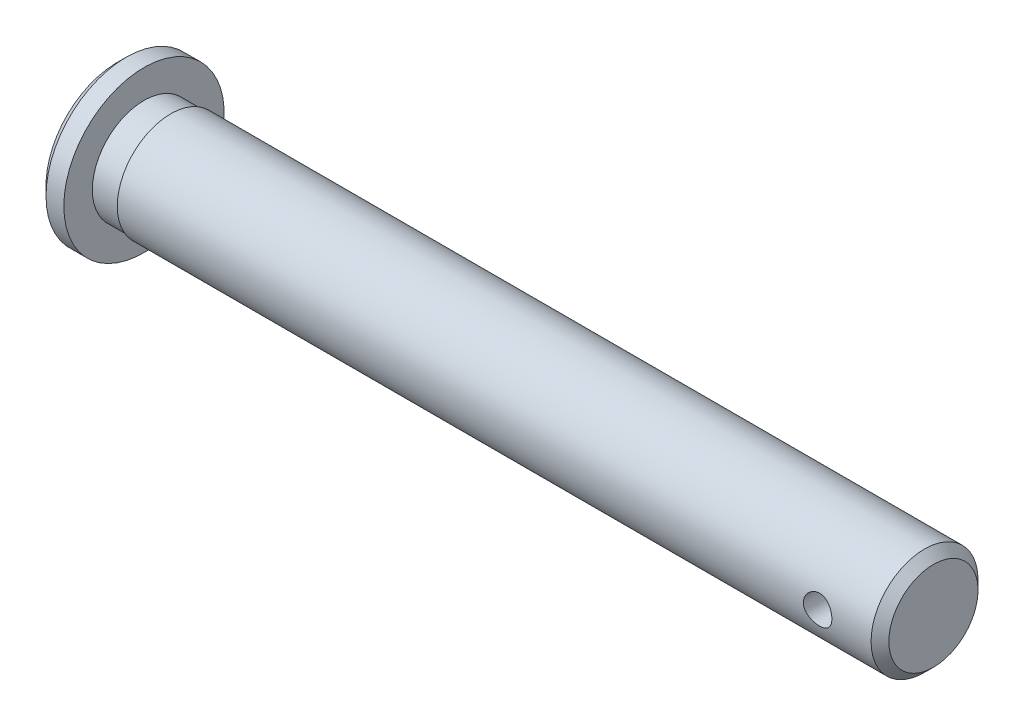
ISO-10303-21;
HEADER;
FILE_DESCRIPTION(('STEP AP214'),'2;1');
FILE_NAME('part.step','',(''),(''),'','','');
FILE_SCHEMA(('AUTOMOTIVE_DESIGN { 1 0 10303 214 1 1 1 1 }'));
ENDSEC;
DATA;
#1=APPLICATION_CONTEXT('core data for automotive mechanical design processes');
#2=APPLICATION_PROTOCOL_DEFINITION('international standard','automotive_design',2000,#1);
#3=PRODUCT_CONTEXT('',#1,'mechanical');
#4=PRODUCT('Part','Part','',(#3));
#5=PRODUCT_RELATED_PRODUCT_CATEGORY('part','',(#4));
#6=PRODUCT_DEFINITION_FORMATION('','',#4);
#7=PRODUCT_DEFINITION_CONTEXT('part definition',#1,'design');
#8=PRODUCT_DEFINITION('design','',#6,#7);
#9=PRODUCT_DEFINITION_SHAPE('','',#8);
#10=(LENGTH_UNIT() NAMED_UNIT(*) SI_UNIT(.MILLI.,.METRE.));
#11=(NAMED_UNIT(*) PLANE_ANGLE_UNIT() SI_UNIT($,.RADIAN.));
#12=(NAMED_UNIT(*) SI_UNIT($,.STERADIAN.) SOLID_ANGLE_UNIT());
#13=UNCERTAINTY_MEASURE_WITH_UNIT(LENGTH_MEASURE(1.E-05),#10,'distance_accuracy_value','');
#14=(GEOMETRIC_REPRESENTATION_CONTEXT(3) GLOBAL_UNCERTAINTY_ASSIGNED_CONTEXT((#13)) GLOBAL_UNIT_ASSIGNED_CONTEXT((#10,
#11,#12)) REPRESENTATION_CONTEXT('',''));
#15=CARTESIAN_POINT('',(0.,0.,0.));
#16=DIRECTION('',(0.,0.,1.));
#17=DIRECTION('',(1.,0.,0.));
#18=AXIS2_PLACEMENT_3D('',#15,#16,#17);
#19=CARTESIAN_POINT('',(-1.5,0.,0.));
#20=DIRECTION('',(1.,0.,0.));
#21=DIRECTION('',(0.,0.,-1.));
#22=AXIS2_PLACEMENT_3D('',#19,#20,#21);
#23=PLANE('',#22);
#24=CARTESIAN_POINT('',(-1.5,0.,0.));
#25=DIRECTION('',(1.,0.,0.));
#26=DIRECTION('',(0.,0.,-1.));
#27=AXIS2_PLACEMENT_3D('',#24,#25,#26);
#28=CIRCLE('',#27,4.);
#29=CARTESIAN_POINT('',(-1.5,0.,-4.));
#30=VERTEX_POINT('',#29);
#31=EDGE_CURVE('E42',#30,#30,#28,.F.);
#32=ORIENTED_EDGE('',*,*,#31,.T.);
#33=EDGE_LOOP('',(#32));
#34=FACE_BOUND('',#33,.T.);
#35=ADVANCED_FACE('F35',(#34),#23,.F.);
#36=CARTESIAN_POINT('',(0.,0.,0.));
#37=DIRECTION('',(-1.,0.,0.));
#38=DIRECTION('',(0.,0.,1.));
#39=AXIS2_PLACEMENT_3D('',#36,#37,#38);
#40=CYLINDRICAL_SURFACE('',#39,4.5);
#41=CARTESIAN_POINT('',(-0.999999999999994,0.,0.));
#42=DIRECTION('',(1.,0.,0.));
#43=DIRECTION('',(0.,0.,-1.));
#44=AXIS2_PLACEMENT_3D('',#41,#42,#43);
#45=CIRCLE('',#44,4.5);
#46=CARTESIAN_POINT('',(-0.999999999999994,0.,-4.5));
#47=VERTEX_POINT('',#46);
#48=EDGE_CURVE('E10',#47,#47,#45,.T.);
#49=ORIENTED_EDGE('',*,*,#48,.T.);
#50=EDGE_LOOP('',(#49));
#51=FACE_BOUND('',#50,.T.);
#52=CARTESIAN_POINT('',(0.,0.,0.));
#53=DIRECTION('',(-1.,0.,0.));
#54=DIRECTION('',(0.,0.,1.));
#55=AXIS2_PLACEMENT_3D('',#52,#53,#54);
#56=CIRCLE('',#55,4.5);
#57=CARTESIAN_POINT('',(0.,0.,4.5));
#58=VERTEX_POINT('',#57);
#59=EDGE_CURVE('E119',#58,#58,#56,.T.);
#60=ORIENTED_EDGE('',*,*,#59,.T.);
#61=EDGE_LOOP('',(#60));
#62=FACE_BOUND('',#61,.T.);
#63=ADVANCED_FACE('F86',(#51,#62),#40,.T.);
#64=CARTESIAN_POINT('',(0.,4.5,0.));
#65=DIRECTION('',(-1.,0.,0.));
#66=DIRECTION('',(0.,0.,1.));
#67=AXIS2_PLACEMENT_3D('',#64,#65,#66);
#68=PLANE('',#67);
#69=ORIENTED_EDGE('',*,*,#59,.F.);
#70=EDGE_LOOP('',(#69));
#71=FACE_BOUND('',#70,.T.);
#72=CARTESIAN_POINT('',(0.,0.,0.));
#73=DIRECTION('',(-1.,0.,0.));
#74=DIRECTION('',(0.,0.,1.));
#75=AXIS2_PLACEMENT_3D('',#72,#73,#74);
#76=CIRCLE('',#75,2.9);
#77=CARTESIAN_POINT('',(0.,0.,2.9));
#78=VERTEX_POINT('',#77);
#79=EDGE_CURVE('E115',#78,#78,#76,.T.);
#80=ORIENTED_EDGE('',*,*,#79,.T.);
#81=EDGE_LOOP('',(#80));
#82=FACE_BOUND('',#81,.T.);
#83=ADVANCED_FACE('F91',(#71,#82),#68,.F.);
#84=CARTESIAN_POINT('',(0.,0.,0.));
#85=DIRECTION('',(-1.,0.,0.));
#86=DIRECTION('',(0.,0.,1.));
#87=AXIS2_PLACEMENT_3D('',#84,#85,#86);
#88=CYLINDRICAL_SURFACE('',#87,2.9);
#89=ORIENTED_EDGE('',*,*,#79,.F.);
#90=EDGE_LOOP('',(#89));
#91=FACE_BOUND('',#90,.T.);
#92=CARTESIAN_POINT('',(1.5,0.,0.));
#93=DIRECTION('',(-1.,0.,0.));
#94=DIRECTION('',(0.,0.,1.));
#95=AXIS2_PLACEMENT_3D('',#92,#93,#94);
#96=CIRCLE('',#95,2.9);
#97=CARTESIAN_POINT('',(1.5,0.,2.9));
#98=VERTEX_POINT('',#97);
#99=EDGE_CURVE('E112',#98,#98,#96,.T.);
#100=ORIENTED_EDGE('',*,*,#99,.T.);
#101=EDGE_LOOP('',(#100));
#102=FACE_BOUND('',#101,.T.);
#103=ADVANCED_FACE('F126',(#91,#102),#88,.T.);
#104=CARTESIAN_POINT('',(1.5,2.9,0.));
#105=DIRECTION('',(1.,0.,0.));
#106=DIRECTION('',(0.,0.,-1.));
#107=AXIS2_PLACEMENT_3D('',#104,#105,#106);
#108=PLANE('',#107);
#109=ORIENTED_EDGE('',*,*,#99,.F.);
#110=EDGE_LOOP('',(#109));
#111=FACE_BOUND('',#110,.T.);
#112=CARTESIAN_POINT('',(1.5,0.,0.));
#113=DIRECTION('',(-1.,0.,0.));
#114=DIRECTION('',(0.,0.,1.));
#115=AXIS2_PLACEMENT_3D('',#112,#113,#114);
#116=CIRCLE('',#115,3.);
#117=CARTESIAN_POINT('',(1.5,0.,3.));
#118=VERTEX_POINT('',#117);
#119=EDGE_CURVE('E63',#118,#118,#116,.T.);
#120=ORIENTED_EDGE('',*,*,#119,.T.);
#121=EDGE_LOOP('',(#120));
#122=FACE_BOUND('',#121,.T.);
#123=ADVANCED_FACE('F83',(#111,#122),#108,.F.);
#124=CARTESIAN_POINT('',(0.,0.,0.));
#125=DIRECTION('',(-1.,0.,0.));
#126=DIRECTION('',(0.,0.,1.));
#127=AXIS2_PLACEMENT_3D('',#124,#125,#126);
#128=CYLINDRICAL_SURFACE('',#127,3.);
#129=CARTESIAN_POINT('',(43.8,0.,0.));
#130=DIRECTION('',(-1.,0.,0.));
#131=DIRECTION('',(0.,0.,1.));
#132=AXIS2_PLACEMENT_3D('',#129,#130,#131);
#133=CIRCLE('',#132,3.);
#134=CARTESIAN_POINT('',(43.8,0.,3.));
#135=VERTEX_POINT('',#134);
#136=EDGE_CURVE('E50',#135,#135,#133,.T.);
#137=ORIENTED_EDGE('',*,*,#136,.T.);
#138=EDGE_LOOP('',(#137));
#139=FACE_BOUND('',#138,.T.);
#140=CARTESIAN_POINT('',(41.6,0.,-3.));
#141=CARTESIAN_POINT('',(41.5999989532261,0.044101822333142,-2.99999933524065));
#142=CARTESIAN_POINT('',(41.5963409543241,0.0882148640887367,-2.99901794464862));
#143=CARTESIAN_POINT('',(41.5818315077045,0.175170180541786,-2.99519829448662));
#144=CARTESIAN_POINT('',(41.5709765982296,0.218011833327635,-2.9923591413303));
#145=CARTESIAN_POINT('',(41.5424513332544,0.301156635618128,-2.98513733301121));
#146=CARTESIAN_POINT('',(41.5247897649336,0.341462980406118,-2.98075666852169));
#147=CARTESIAN_POINT('',(41.4831851029334,0.418541474557067,-2.97091479660652));
#148=CARTESIAN_POINT('',(41.4592415906563,0.455313388179851,-2.96545351718002));
#149=CARTESIAN_POINT('',(41.4051665934346,0.525131801496012,-2.95389845960869));
#150=CARTESIAN_POINT('',(41.3749165327966,0.558084675945127,-2.9477938707174));
#151=CARTESIAN_POINT('',(41.3093406067747,0.618514854642541,-2.93570963871569));
#152=CARTESIAN_POINT('',(41.2740140889533,0.645991453982618,-2.92973001177898));
#153=CARTESIAN_POINT('',(41.1985407060695,0.695145636973706,-2.91846214986764));
#154=CARTESIAN_POINT('',(41.1583214686941,0.716715510946113,-2.91318755429117));
#155=CARTESIAN_POINT('',(41.0746639555642,0.75275019230782,-2.90408590923454));
#156=CARTESIAN_POINT('',(41.0312262750719,0.767216309804885,-2.9002585928704));
#157=CARTESIAN_POINT('',(40.9434017848693,0.788307680905704,-2.89459646334927));
#158=CARTESIAN_POINT('',(40.8990585840191,0.795102680979747,-2.89271859176123));
#159=CARTESIAN_POINT('',(40.8098249266668,0.801188138824373,-2.89103932417876));
#160=CARTESIAN_POINT('',(40.7649345739857,0.800479998822946,-2.89123754019361));
#161=CARTESIAN_POINT('',(40.6772058338511,0.791714040010487,-2.89364951507618));
#162=CARTESIAN_POINT('',(40.6343451271848,0.783861624258978,-2.89580694201076));
#163=CARTESIAN_POINT('',(40.5505726662173,0.761358994888819,-2.90180405235812));
#164=CARTESIAN_POINT('',(40.5096610679698,0.746708237972005,-2.90564387021998));
#165=CARTESIAN_POINT('',(40.4304127424766,0.710857427861005,-2.91462264698391));
#166=CARTESIAN_POINT('',(40.3921102642855,0.689585364551136,-2.91977577127223));
#167=CARTESIAN_POINT('',(40.3195463364594,0.641146015295121,-2.93079291857236));
#168=CARTESIAN_POINT('',(40.2852856843374,0.613977568897011,-2.93665708142145));
#169=CARTESIAN_POINT('',(40.2206044010181,0.553466429053679,-2.94867004251873));
#170=CARTESIAN_POINT('',(40.190345472674,0.519951250913202,-2.95482188595513));
#171=CARTESIAN_POINT('',(40.1358444878599,0.448247067282554,-2.96654552510546));
#172=CARTESIAN_POINT('',(40.111602668519,0.410057877682037,-2.97211729795427));
#173=CARTESIAN_POINT('',(40.0697528388701,0.329839302198978,-2.98208728159312));
#174=CARTESIAN_POINT('',(40.0521740918206,0.287793961020713,-2.98648029133423));
#175=CARTESIAN_POINT('',(40.0243811244746,0.201200917756155,-2.99356017760401));
#176=CARTESIAN_POINT('',(40.0141652949104,0.156653764771325,-2.996247426935));
#177=CARTESIAN_POINT('',(40.0016420492329,0.0677016332582017,-2.99955663423354));
#178=CARTESIAN_POINT('',(39.9991147840596,0.0233296950565481,-3.00023598988385));
#179=CARTESIAN_POINT('',(40.0014332656988,-0.0652040183604825,-2.99961788676677));
#180=CARTESIAN_POINT('',(40.0062782504423,-0.109365814824848,-2.99832063232137));
#181=CARTESIAN_POINT('',(40.023023378984,-0.195440979960716,-2.99393214198412));
#182=CARTESIAN_POINT('',(40.0348008984791,-0.237379940811119,-2.99087210618547));
#183=CARTESIAN_POINT('',(40.0649343778032,-0.318682788470426,-2.98330517957641));
#184=CARTESIAN_POINT('',(40.0832910505002,-0.358046395686403,-2.9787981319841));
#185=CARTESIAN_POINT('',(40.1264695548723,-0.433935389867197,-2.96870264223867));
#186=CARTESIAN_POINT('',(40.1514109867192,-0.470390075384523,-2.96309474642193));
#187=CARTESIAN_POINT('',(40.2069006520631,-0.538673854158813,-2.95144580946015));
#188=CARTESIAN_POINT('',(40.2374499930399,-0.570502031519499,-2.94540468290222));
#189=CARTESIAN_POINT('',(40.3043142309984,-0.629555697915278,-2.9333589834749));
#190=CARTESIAN_POINT('',(40.3407674245601,-0.656626076999947,-2.92736024574781));
#191=CARTESIAN_POINT('',(40.4178258784379,-0.704268764739798,-2.91626578870034));
#192=CARTESIAN_POINT('',(40.4584309654415,-0.724841344486111,-2.91117003171109));
#193=CARTESIAN_POINT('',(40.5424381228353,-0.758749646345947,-2.9025170736066));
#194=CARTESIAN_POINT('',(40.5858223247493,-0.772127249023593,-2.89895099369493));
#195=CARTESIAN_POINT('',(40.6743357278935,-0.791364820483175,-2.89375930092876));
#196=CARTESIAN_POINT('',(40.7194644801468,-0.797226710411955,-2.89213319219128));
#197=CARTESIAN_POINT('',(40.808597915149,-0.801155958613014,-2.89104697818674));
#198=CARTESIAN_POINT('',(40.8525909281021,-0.799472622471943,-2.89151759094413));
#199=CARTESIAN_POINT('',(40.9396414056052,-0.788937504002252,-2.89440958435317));
#200=CARTESIAN_POINT('',(40.9826988942006,-0.780085906140237,-2.89683091480545));
#201=CARTESIAN_POINT('',(41.0663423008516,-0.75561006279867,-2.90331028428499));
#202=CARTESIAN_POINT('',(41.1069447370928,-0.740038644302289,-2.90735554007653));
#203=CARTESIAN_POINT('',(41.1849915322137,-0.702606218249583,-2.91662727254676));
#204=CARTESIAN_POINT('',(41.2224353945202,-0.680744224098479,-2.92185393448601));
#205=CARTESIAN_POINT('',(41.2942921437986,-0.630595637075259,-2.93309168576127));
#206=CARTESIAN_POINT('',(41.3285834139905,-0.602138919071636,-2.93912133240661));
#207=CARTESIAN_POINT('',(41.3919849806669,-0.539932214044401,-2.95118201513218));
#208=CARTESIAN_POINT('',(41.4210940154676,-0.506180941743495,-2.95721305119381));
#209=CARTESIAN_POINT('',(41.4739168950587,-0.433471992435468,-2.96875124961583));
#210=CARTESIAN_POINT('',(41.4975020042597,-0.394418384700709,-2.97424444525819));
#211=CARTESIAN_POINT('',(41.5377349663718,-0.312755456166755,-2.9839352404116));
#212=CARTESIAN_POINT('',(41.5543872702654,-0.270148437878518,-2.98813367073438));
#213=CARTESIAN_POINT('',(41.5781101141662,-0.189749881952396,-2.99421901005387));
#214=CARTESIAN_POINT('',(41.586299753437,-0.152304806626014,-2.99637108237041));
#215=CARTESIAN_POINT('',(41.5972448824668,-0.0765759181268306,-2.99926179614582));
#216=CARTESIAN_POINT('',(41.60000090888,-0.0382921881619442,-3.00000057718908));
#217=CARTESIAN_POINT('',(41.6,0.,-3.));
#218=B_SPLINE_CURVE_WITH_KNOTS('',3,(#140,#141,#142,#143,#144,#145,#146,#147,#148,#149,#150,
#151,#152,#153,#154,#155,#156,#157,#158,#159,#160,#161,#162,#163,#164,#165,#166,#167,#168,#169,
#170,#171,#172,#173,#174,#175,#176,#177,#178,#179,#180,#181,#182,#183,#184,#185,#186,#187,#188,
#189,#190,#191,#192,#193,#194,#195,#196,#197,#198,#199,#200,#201,#202,#203,#204,#205,#206,#207,
#208,#209,#210,#211,#212,#213,#214,#215,#216,#217),.UNSPECIFIED.,.T.,.F.,(4,2,2,2,2,2,2,2,2,2,2,
2,2,2,2,2,2,2,2,2,2,2,2,2,2,2,2,2,2,2,2,2,2,2,2,2,2,2,4),(0.,0.132165039579828,
0.264393697504581,0.396452221188778,0.528519546834703,0.663339591819868,0.798176979700596,
0.935330330092925,1.07245837651881,1.20648863299036,1.34049384159395,1.47076400816065,
1.60104458722842,1.73279469336265,1.86457075244718,2.00064503922595,2.13672468772706,
2.27339523838884,2.41003590873723,2.54273087007486,2.67541211567807,2.80581414254513,
2.93623030307913,3.06920114399487,3.20219827301222,3.33894598550783,3.4756879920731,
3.61162519076597,3.74752763461532,3.87897336957383,4.01041572204176,4.1408430617526,
4.2712908684514,4.40557735824495,4.5398964972892,4.67708900908298,4.81419330454011,
4.92895927593274,5.04371391182492),.UNSPECIFIED.);
#219=CARTESIAN_POINT('',(41.6,0.,-3.));
#220=VERTEX_POINT('',#219);
#221=EDGE_CURVE('E56',#220,#220,#218,.T.);
#222=ORIENTED_EDGE('',*,*,#221,.T.);
#223=EDGE_LOOP('',(#222));
#224=FACE_BOUND('',#223,.T.);
#225=CARTESIAN_POINT('',(41.6,0.,3.));
#226=CARTESIAN_POINT('',(41.5999989532261,-0.044101822333142,2.99999933524065));
#227=CARTESIAN_POINT('',(41.5963409543241,-0.0882148640887367,2.99901794464862));
#228=CARTESIAN_POINT('',(41.5818315077045,-0.175170180541786,2.99519829448662));
#229=CARTESIAN_POINT('',(41.5709765982296,-0.218011833327635,2.9923591413303));
#230=CARTESIAN_POINT('',(41.5424513332544,-0.301156635618128,2.98513733301121));
#231=CARTESIAN_POINT('',(41.5247897649336,-0.341462980406118,2.98075666852169));
#232=CARTESIAN_POINT('',(41.4831851029334,-0.418541474557067,2.97091479660652));
#233=CARTESIAN_POINT('',(41.4592415906563,-0.455313388179851,2.96545351718002));
#234=CARTESIAN_POINT('',(41.4051665934346,-0.525131801496012,2.95389845960869));
#235=CARTESIAN_POINT('',(41.3749165327966,-0.558084675945127,2.9477938707174));
#236=CARTESIAN_POINT('',(41.3093406067747,-0.618514854642541,2.93570963871569));
#237=CARTESIAN_POINT('',(41.2740140889533,-0.645991453982618,2.92973001177898));
#238=CARTESIAN_POINT('',(41.1985407060695,-0.695145636973706,2.91846214986764));
#239=CARTESIAN_POINT('',(41.1583214686941,-0.716715510946113,2.91318755429117));
#240=CARTESIAN_POINT('',(41.0746639555642,-0.75275019230782,2.90408590923454));
#241=CARTESIAN_POINT('',(41.0312262750719,-0.767216309804885,2.9002585928704));
#242=CARTESIAN_POINT('',(40.9434017848693,-0.788307680905704,2.89459646334927));
#243=CARTESIAN_POINT('',(40.8990585840191,-0.795102680979747,2.89271859176123));
#244=CARTESIAN_POINT('',(40.8098249266668,-0.801188138824373,2.89103932417876));
#245=CARTESIAN_POINT('',(40.7649345739857,-0.800479998822946,2.89123754019361));
#246=CARTESIAN_POINT('',(40.6772058338511,-0.791714040010487,2.89364951507618));
#247=CARTESIAN_POINT('',(40.6343451271848,-0.783861624258978,2.89580694201076));
#248=CARTESIAN_POINT('',(40.5505726662173,-0.761358994888819,2.90180405235812));
#249=CARTESIAN_POINT('',(40.5096610679698,-0.746708237972005,2.90564387021998));
#250=CARTESIAN_POINT('',(40.4304127424766,-0.710857427861005,2.91462264698391));
#251=CARTESIAN_POINT('',(40.3921102642855,-0.689585364551136,2.91977577127223));
#252=CARTESIAN_POINT('',(40.3195463364594,-0.641146015295121,2.93079291857236));
#253=CARTESIAN_POINT('',(40.2852856843374,-0.613977568897011,2.93665708142145));
#254=CARTESIAN_POINT('',(40.2206044010181,-0.553466429053679,2.94867004251873));
#255=CARTESIAN_POINT('',(40.190345472674,-0.519951250913202,2.95482188595513));
#256=CARTESIAN_POINT('',(40.1358444878599,-0.448247067282554,2.96654552510546));
#257=CARTESIAN_POINT('',(40.111602668519,-0.410057877682037,2.97211729795427));
#258=CARTESIAN_POINT('',(40.0697528388701,-0.329839302198978,2.98208728159312));
#259=CARTESIAN_POINT('',(40.0521740918206,-0.287793961020713,2.98648029133423));
#260=CARTESIAN_POINT('',(40.0243811244746,-0.201200917756155,2.99356017760401));
#261=CARTESIAN_POINT('',(40.0141652949104,-0.156653764771325,2.996247426935));
#262=CARTESIAN_POINT('',(40.0016420492329,-0.0677016332582017,2.99955663423354));
#263=CARTESIAN_POINT('',(39.9991147840596,-0.0233296950565481,3.00023598988385));
#264=CARTESIAN_POINT('',(40.0014332656988,0.0652040183604825,2.99961788676677));
#265=CARTESIAN_POINT('',(40.0062782504423,0.109365814824848,2.99832063232137));
#266=CARTESIAN_POINT('',(40.023023378984,0.195440979960716,2.99393214198412));
#267=CARTESIAN_POINT('',(40.0348008984791,0.237379940811119,2.99087210618547));
#268=CARTESIAN_POINT('',(40.0649343778032,0.318682788470426,2.98330517957641));
#269=CARTESIAN_POINT('',(40.0832910505002,0.358046395686403,2.9787981319841));
#270=CARTESIAN_POINT('',(40.1264695548723,0.433935389867197,2.96870264223867));
#271=CARTESIAN_POINT('',(40.1514109867192,0.470390075384523,2.96309474642193));
#272=CARTESIAN_POINT('',(40.2069006520631,0.538673854158813,2.95144580946015));
#273=CARTESIAN_POINT('',(40.2374499930399,0.570502031519499,2.94540468290222));
#274=CARTESIAN_POINT('',(40.3043142309984,0.629555697915278,2.9333589834749));
#275=CARTESIAN_POINT('',(40.3407674245601,0.656626076999947,2.92736024574781));
#276=CARTESIAN_POINT('',(40.4178258784379,0.704268764739798,2.91626578870034));
#277=CARTESIAN_POINT('',(40.4584309654415,0.724841344486111,2.91117003171109));
#278=CARTESIAN_POINT('',(40.5424381228353,0.758749646345947,2.9025170736066));
#279=CARTESIAN_POINT('',(40.5858223247493,0.772127249023593,2.89895099369493));
#280=CARTESIAN_POINT('',(40.6743357278935,0.791364820483175,2.89375930092876));
#281=CARTESIAN_POINT('',(40.7194644801468,0.797226710411955,2.89213319219128));
#282=CARTESIAN_POINT('',(40.808597915149,0.801155958613014,2.89104697818674));
#283=CARTESIAN_POINT('',(40.8525909281021,0.799472622471943,2.89151759094413));
#284=CARTESIAN_POINT('',(40.9396414056052,0.788937504002252,2.89440958435317));
#285=CARTESIAN_POINT('',(40.9826988942006,0.780085906140237,2.89683091480545));
#286=CARTESIAN_POINT('',(41.0663423008516,0.75561006279867,2.90331028428499));
#287=CARTESIAN_POINT('',(41.1069447370928,0.740038644302289,2.90735554007653));
#288=CARTESIAN_POINT('',(41.1849915322137,0.702606218249583,2.91662727254676));
#289=CARTESIAN_POINT('',(41.2224353945202,0.680744224098479,2.92185393448601));
#290=CARTESIAN_POINT('',(41.2942921437986,0.630595637075259,2.93309168576127));
#291=CARTESIAN_POINT('',(41.3285834139905,0.602138919071636,2.93912133240661));
#292=CARTESIAN_POINT('',(41.3919849806669,0.539932214044401,2.95118201513218));
#293=CARTESIAN_POINT('',(41.4210940154676,0.506180941743495,2.95721305119381));
#294=CARTESIAN_POINT('',(41.4739168950587,0.433471992435468,2.96875124961583));
#295=CARTESIAN_POINT('',(41.4975020042597,0.394418384700709,2.97424444525819));
#296=CARTESIAN_POINT('',(41.5377349663718,0.312755456166755,2.9839352404116));
#297=CARTESIAN_POINT('',(41.5543872702654,0.270148437878518,2.98813367073438));
#298=CARTESIAN_POINT('',(41.5781101141662,0.189749881952396,2.99421901005387));
#299=CARTESIAN_POINT('',(41.586299753437,0.152304806626014,2.99637108237041));
#300=CARTESIAN_POINT('',(41.5972448824668,0.0765759181268306,2.99926179614582));
#301=CARTESIAN_POINT('',(41.60000090888,0.0382921881619442,3.00000057718908));
#302=CARTESIAN_POINT('',(41.6,0.,3.));
#303=B_SPLINE_CURVE_WITH_KNOTS('',3,(#225,#226,#227,#228,#229,#230,#231,#232,#233,#234,#235,
#236,#237,#238,#239,#240,#241,#242,#243,#244,#245,#246,#247,#248,#249,#250,#251,#252,#253,#254,
#255,#256,#257,#258,#259,#260,#261,#262,#263,#264,#265,#266,#267,#268,#269,#270,#271,#272,#273,
#274,#275,#276,#277,#278,#279,#280,#281,#282,#283,#284,#285,#286,#287,#288,#289,#290,#291,#292,
#293,#294,#295,#296,#297,#298,#299,#300,#301,#302),.UNSPECIFIED.,.T.,.F.,(4,2,2,2,2,2,2,2,2,2,2,
2,2,2,2,2,2,2,2,2,2,2,2,2,2,2,2,2,2,2,2,2,2,2,2,2,2,2,4),(0.,0.132165039579828,
0.264393697504581,0.396452221188778,0.528519546834703,0.663339591819868,0.798176979700596,
0.935330330092925,1.07245837651881,1.20648863299036,1.34049384159395,1.47076400816065,
1.60104458722842,1.73279469336265,1.86457075244718,2.00064503922595,2.13672468772706,
2.27339523838884,2.41003590873723,2.54273087007486,2.67541211567807,2.80581414254513,
2.93623030307913,3.06920114399487,3.20219827301222,3.33894598550783,3.4756879920731,
3.61162519076597,3.74752763461532,3.87897336957383,4.01041572204176,4.1408430617526,
4.2712908684514,4.40557735824495,4.5398964972892,4.67708900908298,4.81419330454011,
4.92895927593274,5.04371391182492),.UNSPECIFIED.);
#304=CARTESIAN_POINT('',(41.6,0.,3.));
#305=VERTEX_POINT('',#304);
#306=EDGE_CURVE('E55',#305,#305,#303,.T.);
#307=ORIENTED_EDGE('',*,*,#306,.T.);
#308=EDGE_LOOP('',(#307));
#309=FACE_BOUND('',#308,.T.);
#310=ORIENTED_EDGE('',*,*,#119,.F.);
#311=EDGE_LOOP('',(#310));
#312=FACE_BOUND('',#311,.T.);
#313=ADVANCED_FACE('F67',(#139,#224,#309,#312),#128,.T.);
#314=CARTESIAN_POINT('',(44.3,3.,0.));
#315=DIRECTION('',(-1.,0.,0.));
#316=DIRECTION('',(0.,0.,1.));
#317=AXIS2_PLACEMENT_3D('',#314,#315,#316);
#318=PLANE('',#317);
#319=CARTESIAN_POINT('',(44.3,0.,0.));
#320=DIRECTION('',(-1.,0.,0.));
#321=DIRECTION('',(0.,0.,1.));
#322=AXIS2_PLACEMENT_3D('',#319,#320,#321);
#323=CIRCLE('',#322,2.5);
#324=CARTESIAN_POINT('',(44.3,0.,2.5));
#325=VERTEX_POINT('',#324);
#326=EDGE_CURVE('E46',#325,#325,#323,.F.);
#327=ORIENTED_EDGE('',*,*,#326,.T.);
#328=EDGE_LOOP('',(#327));
#329=FACE_BOUND('',#328,.T.);
#330=ADVANCED_FACE('F75',(#329),#318,.F.);
#331=CARTESIAN_POINT('',(40.8,0.,-4.5));
#332=DIRECTION('',(0.,0.,1.));
#333=DIRECTION('',(1.,0.,0.));
#334=AXIS2_PLACEMENT_3D('',#331,#332,#333);
#335=CYLINDRICAL_SURFACE('',#334,0.800000000000003);
#336=ORIENTED_EDGE('',*,*,#221,.F.);
#337=EDGE_LOOP('',(#336));
#338=FACE_BOUND('',#337,.T.);
#339=ORIENTED_EDGE('',*,*,#306,.F.);
#340=EDGE_LOOP('',(#339));
#341=FACE_BOUND('',#340,.T.);
#342=ADVANCED_FACE('F71',(#338,#341),#335,.F.);
#343=CARTESIAN_POINT('',(43.8,0.,0.));
#344=DIRECTION('',(-1.,0.,0.));
#345=DIRECTION('',(0.,0.,1.));
#346=AXIS2_PLACEMENT_3D('',#343,#344,#345);
#347=CONICAL_SURFACE('',#346,3.,0.78539816339745);
#348=ORIENTED_EDGE('',*,*,#326,.F.);
#349=EDGE_LOOP('',(#348));
#350=FACE_BOUND('',#349,.T.);
#351=ORIENTED_EDGE('',*,*,#136,.F.);
#352=EDGE_LOOP('',(#351));
#353=FACE_BOUND('',#352,.T.);
#354=ADVANCED_FACE('F74',(#350,#353),#347,.T.);
#355=CARTESIAN_POINT('',(-1.5,0.,0.));
#356=DIRECTION('',(1.,0.,0.));
#357=DIRECTION('',(0.,0.,-1.));
#358=AXIS2_PLACEMENT_3D('',#355,#356,#357);
#359=CONICAL_SURFACE('',#358,4.,0.785398163397447);
#360=ORIENTED_EDGE('',*,*,#48,.F.);
#361=EDGE_LOOP('',(#360));
#362=FACE_BOUND('',#361,.T.);
#363=ORIENTED_EDGE('',*,*,#31,.F.);
#364=EDGE_LOOP('',(#363));
#365=FACE_BOUND('',#364,.T.);
#366=ADVANCED_FACE('F37',(#362,#365),#359,.T.);
#367=CLOSED_SHELL('',(#35,#63,#83,#103,#123,#313,#330,#342,#354,#366));
#368=MANIFOLD_SOLID_BREP('B2',#367);
#369=ADVANCED_BREP_SHAPE_REPRESENTATION('',(#18,#368),#14);
#370=SHAPE_DEFINITION_REPRESENTATION(#9,#369);
ENDSEC;
END-ISO-10303-21;
